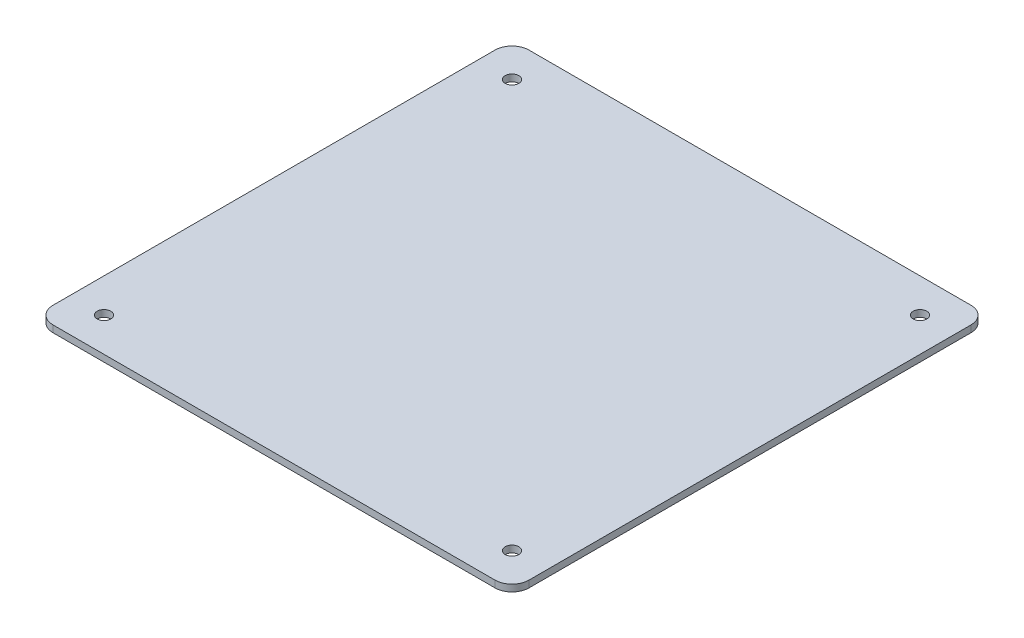
ISO-10303-21;
HEADER;
FILE_DESCRIPTION(('STEP AP214'),'2;1');
FILE_NAME('part.step','',(''),(''),'','','');
FILE_SCHEMA(('AUTOMOTIVE_DESIGN { 1 0 10303 214 1 1 1 1 }'));
ENDSEC;
DATA;
#1=APPLICATION_CONTEXT('core data for automotive mechanical design processes');
#2=APPLICATION_PROTOCOL_DEFINITION('international standard','automotive_design',2000,#1);
#3=PRODUCT_CONTEXT('',#1,'mechanical');
#4=PRODUCT('Part','Part','',(#3));
#5=PRODUCT_RELATED_PRODUCT_CATEGORY('part','',(#4));
#6=PRODUCT_DEFINITION_FORMATION('','',#4);
#7=PRODUCT_DEFINITION_CONTEXT('part definition',#1,'design');
#8=PRODUCT_DEFINITION('design','',#6,#7);
#9=PRODUCT_DEFINITION_SHAPE('','',#8);
#10=(LENGTH_UNIT() NAMED_UNIT(*) SI_UNIT(.MILLI.,.METRE.));
#11=(NAMED_UNIT(*) PLANE_ANGLE_UNIT() SI_UNIT($,.RADIAN.));
#12=(NAMED_UNIT(*) SI_UNIT($,.STERADIAN.) SOLID_ANGLE_UNIT());
#13=UNCERTAINTY_MEASURE_WITH_UNIT(LENGTH_MEASURE(1.E-05),#10,'distance_accuracy_value','');
#14=(GEOMETRIC_REPRESENTATION_CONTEXT(3) GLOBAL_UNCERTAINTY_ASSIGNED_CONTEXT((#13)) GLOBAL_UNIT_ASSIGNED_CONTEXT((#10,
#11,#12)) REPRESENTATION_CONTEXT('',''));
#15=CARTESIAN_POINT('',(0.,0.,0.));
#16=DIRECTION('',(0.,0.,1.));
#17=DIRECTION('',(1.,0.,0.));
#18=AXIS2_PLACEMENT_3D('',#15,#16,#17);
#19=CARTESIAN_POINT('',(-130.,4.,-130.));
#20=DIRECTION('',(0.,-1.,0.));
#21=DIRECTION('',(0.,0.,-1.));
#22=AXIS2_PLACEMENT_3D('',#19,#20,#21);
#23=CYLINDRICAL_SURFACE('',#22,10.);
#24=CARTESIAN_POINT('',(-130.,0.,-130.));
#25=DIRECTION('',(0.,1.,0.));
#26=DIRECTION('',(0.,0.,-1.));
#27=AXIS2_PLACEMENT_3D('',#24,#25,#26);
#28=CIRCLE('',#27,10.);
#29=CARTESIAN_POINT('',(-130.,0.,-140.));
#30=VERTEX_POINT('',#29);
#31=CARTESIAN_POINT('',(-140.,0.,-130.));
#32=VERTEX_POINT('',#31);
#33=EDGE_CURVE('E139',#30,#32,#28,.T.);
#34=ORIENTED_EDGE('',*,*,#33,.T.);
#35=DIRECTION('',(0.,-1.,0.));
#36=VECTOR('',#35,1.);
#37=CARTESIAN_POINT('',(-140.,4.,-130.));
#38=LINE('',#37,#36);
#39=CARTESIAN_POINT('',(-140.,4.,-130.));
#40=VERTEX_POINT('',#39);
#41=EDGE_CURVE('E11',#40,#32,#38,.T.);
#42=ORIENTED_EDGE('',*,*,#41,.F.);
#43=CARTESIAN_POINT('',(-130.,4.,-130.));
#44=DIRECTION('',(0.,1.,0.));
#45=DIRECTION('',(0.,0.,-1.));
#46=AXIS2_PLACEMENT_3D('',#43,#44,#45);
#47=CIRCLE('',#46,10.);
#48=CARTESIAN_POINT('',(-130.,4.,-140.));
#49=VERTEX_POINT('',#48);
#50=EDGE_CURVE('E162',#49,#40,#47,.T.);
#51=ORIENTED_EDGE('',*,*,#50,.F.);
#52=DIRECTION('',(0.,-1.,0.));
#53=VECTOR('',#52,1.);
#54=CARTESIAN_POINT('',(-130.,4.,-140.));
#55=LINE('',#54,#53);
#56=EDGE_CURVE('E135',#49,#30,#55,.T.);
#57=ORIENTED_EDGE('',*,*,#56,.T.);
#58=EDGE_LOOP('',(#34,#42,#51,#57));
#59=FACE_BOUND('',#58,.T.);
#60=ADVANCED_FACE('F38',(#59),#23,.T.);
#61=CARTESIAN_POINT('',(-140.,4.,130.));
#62=DIRECTION('',(1.,0.,0.));
#63=DIRECTION('',(0.,0.,-1.));
#64=AXIS2_PLACEMENT_3D('',#61,#62,#63);
#65=PLANE('',#64);
#66=DIRECTION('',(0.,0.,1.));
#67=VECTOR('',#66,1.);
#68=CARTESIAN_POINT('',(-140.,0.,130.));
#69=LINE('',#68,#67);
#70=CARTESIAN_POINT('',(-140.,0.,130.));
#71=VERTEX_POINT('',#70);
#72=EDGE_CURVE('E143',#32,#71,#69,.T.);
#73=ORIENTED_EDGE('',*,*,#72,.T.);
#74=DIRECTION('',(0.,-1.,0.));
#75=VECTOR('',#74,1.);
#76=CARTESIAN_POINT('',(-140.,4.,130.));
#77=LINE('',#76,#75);
#78=CARTESIAN_POINT('',(-140.,4.,130.));
#79=VERTEX_POINT('',#78);
#80=EDGE_CURVE('E47',#79,#71,#77,.T.);
#81=ORIENTED_EDGE('',*,*,#80,.F.);
#82=DIRECTION('',(0.,0.,1.));
#83=VECTOR('',#82,1.);
#84=CARTESIAN_POINT('',(-140.,4.,130.));
#85=LINE('',#84,#83);
#86=EDGE_CURVE('E98',#40,#79,#85,.T.);
#87=ORIENTED_EDGE('',*,*,#86,.F.);
#88=ORIENTED_EDGE('',*,*,#41,.T.);
#89=EDGE_LOOP('',(#73,#81,#87,#88));
#90=FACE_BOUND('',#89,.T.);
#91=ADVANCED_FACE('F267',(#90),#65,.F.);
#92=CARTESIAN_POINT('',(-130.,4.,130.));
#93=DIRECTION('',(0.,-1.,0.));
#94=DIRECTION('',(0.,0.,-1.));
#95=AXIS2_PLACEMENT_3D('',#92,#93,#94);
#96=CYLINDRICAL_SURFACE('',#95,10.);
#97=CARTESIAN_POINT('',(-130.,0.,130.));
#98=DIRECTION('',(0.,1.,0.));
#99=DIRECTION('',(0.,0.,-1.));
#100=AXIS2_PLACEMENT_3D('',#97,#98,#99);
#101=CIRCLE('',#100,10.);
#102=CARTESIAN_POINT('',(-130.,0.,140.));
#103=VERTEX_POINT('',#102);
#104=EDGE_CURVE('E147',#71,#103,#101,.T.);
#105=ORIENTED_EDGE('',*,*,#104,.T.);
#106=DIRECTION('',(0.,-1.,0.));
#107=VECTOR('',#106,1.);
#108=CARTESIAN_POINT('',(-130.,4.,140.));
#109=LINE('',#108,#107);
#110=CARTESIAN_POINT('',(-130.,4.,140.));
#111=VERTEX_POINT('',#110);
#112=EDGE_CURVE('E173',#111,#103,#109,.T.);
#113=ORIENTED_EDGE('',*,*,#112,.F.);
#114=CARTESIAN_POINT('',(-130.,4.,130.));
#115=DIRECTION('',(0.,1.,0.));
#116=DIRECTION('',(0.,0.,-1.));
#117=AXIS2_PLACEMENT_3D('',#114,#115,#116);
#118=CIRCLE('',#117,10.);
#119=EDGE_CURVE('E183',#79,#111,#118,.T.);
#120=ORIENTED_EDGE('',*,*,#119,.F.);
#121=ORIENTED_EDGE('',*,*,#80,.T.);
#122=EDGE_LOOP('',(#105,#113,#120,#121));
#123=FACE_BOUND('',#122,.T.);
#124=ADVANCED_FACE('F181',(#123),#96,.T.);
#125=CARTESIAN_POINT('',(-130.,4.,140.));
#126=DIRECTION('',(0.,0.,-1.));
#127=DIRECTION('',(-1.,0.,0.));
#128=AXIS2_PLACEMENT_3D('',#125,#126,#127);
#129=PLANE('',#128);
#130=DIRECTION('',(1.,0.,0.));
#131=VECTOR('',#130,1.);
#132=CARTESIAN_POINT('',(-130.,0.,140.));
#133=LINE('',#132,#131);
#134=CARTESIAN_POINT('',(130.,0.,140.));
#135=VERTEX_POINT('',#134);
#136=EDGE_CURVE('E150',#103,#135,#133,.T.);
#137=ORIENTED_EDGE('',*,*,#136,.T.);
#138=DIRECTION('',(0.,-1.,0.));
#139=VECTOR('',#138,1.);
#140=CARTESIAN_POINT('',(130.,4.,140.));
#141=LINE('',#140,#139);
#142=CARTESIAN_POINT('',(130.,4.,140.));
#143=VERTEX_POINT('',#142);
#144=EDGE_CURVE('E169',#143,#135,#141,.T.);
#145=ORIENTED_EDGE('',*,*,#144,.F.);
#146=DIRECTION('',(1.,0.,0.));
#147=VECTOR('',#146,1.);
#148=CARTESIAN_POINT('',(-130.,4.,140.));
#149=LINE('',#148,#147);
#150=EDGE_CURVE('E196',#111,#143,#149,.T.);
#151=ORIENTED_EDGE('',*,*,#150,.F.);
#152=ORIENTED_EDGE('',*,*,#112,.T.);
#153=EDGE_LOOP('',(#137,#145,#151,#152));
#154=FACE_BOUND('',#153,.T.);
#155=ADVANCED_FACE('F191',(#154),#129,.F.);
#156=CARTESIAN_POINT('',(130.,4.,130.));
#157=DIRECTION('',(0.,-1.,0.));
#158=DIRECTION('',(0.,0.,-1.));
#159=AXIS2_PLACEMENT_3D('',#156,#157,#158);
#160=CYLINDRICAL_SURFACE('',#159,10.);
#161=CARTESIAN_POINT('',(130.,0.,130.));
#162=DIRECTION('',(0.,1.,0.));
#163=DIRECTION('',(0.,0.,1.));
#164=AXIS2_PLACEMENT_3D('',#161,#162,#163);
#165=CIRCLE('',#164,10.);
#166=CARTESIAN_POINT('',(140.,0.,130.));
#167=VERTEX_POINT('',#166);
#168=EDGE_CURVE('E153',#135,#167,#165,.T.);
#169=ORIENTED_EDGE('',*,*,#168,.T.);
#170=DIRECTION('',(0.,-1.,0.));
#171=VECTOR('',#170,1.);
#172=CARTESIAN_POINT('',(140.,4.,130.));
#173=LINE('',#172,#171);
#174=CARTESIAN_POINT('',(140.,4.,130.));
#175=VERTEX_POINT('',#174);
#176=EDGE_CURVE('E128',#175,#167,#173,.T.);
#177=ORIENTED_EDGE('',*,*,#176,.F.);
#178=CARTESIAN_POINT('',(130.,4.,130.));
#179=DIRECTION('',(0.,1.,0.));
#180=DIRECTION('',(0.,0.,1.));
#181=AXIS2_PLACEMENT_3D('',#178,#179,#180);
#182=CIRCLE('',#181,10.);
#183=EDGE_CURVE('E117',#143,#175,#182,.T.);
#184=ORIENTED_EDGE('',*,*,#183,.F.);
#185=ORIENTED_EDGE('',*,*,#144,.T.);
#186=EDGE_LOOP('',(#169,#177,#184,#185));
#187=FACE_BOUND('',#186,.T.);
#188=ADVANCED_FACE('F194',(#187),#160,.T.);
#189=CARTESIAN_POINT('',(140.,4.,130.));
#190=DIRECTION('',(-1.,0.,0.));
#191=DIRECTION('',(0.,0.,1.));
#192=AXIS2_PLACEMENT_3D('',#189,#190,#191);
#193=PLANE('',#192);
#194=DIRECTION('',(0.,0.,-1.));
#195=VECTOR('',#194,1.);
#196=CARTESIAN_POINT('',(140.,0.,130.));
#197=LINE('',#196,#195);
#198=CARTESIAN_POINT('',(140.,0.,-130.));
#199=VERTEX_POINT('',#198);
#200=EDGE_CURVE('E126',#167,#199,#197,.T.);
#201=ORIENTED_EDGE('',*,*,#200,.T.);
#202=DIRECTION('',(0.,-1.,0.));
#203=VECTOR('',#202,1.);
#204=CARTESIAN_POINT('',(140.,4.,-130.));
#205=LINE('',#204,#203);
#206=CARTESIAN_POINT('',(140.,4.,-130.));
#207=VERTEX_POINT('',#206);
#208=EDGE_CURVE('E123',#207,#199,#205,.T.);
#209=ORIENTED_EDGE('',*,*,#208,.F.);
#210=DIRECTION('',(0.,0.,-1.));
#211=VECTOR('',#210,1.);
#212=CARTESIAN_POINT('',(140.,4.,130.));
#213=LINE('',#212,#211);
#214=EDGE_CURVE('E111',#175,#207,#213,.T.);
#215=ORIENTED_EDGE('',*,*,#214,.F.);
#216=ORIENTED_EDGE('',*,*,#176,.T.);
#217=EDGE_LOOP('',(#201,#209,#215,#216));
#218=FACE_BOUND('',#217,.T.);
#219=ADVANCED_FACE('F124',(#218),#193,.F.);
#220=CARTESIAN_POINT('',(130.,4.,-130.));
#221=DIRECTION('',(0.,-1.,0.));
#222=DIRECTION('',(0.,0.,-1.));
#223=AXIS2_PLACEMENT_3D('',#220,#221,#222);
#224=CYLINDRICAL_SURFACE('',#223,10.);
#225=CARTESIAN_POINT('',(130.,0.,-130.));
#226=DIRECTION('',(0.,1.,0.));
#227=DIRECTION('',(0.,0.,-1.));
#228=AXIS2_PLACEMENT_3D('',#225,#226,#227);
#229=CIRCLE('',#228,10.);
#230=CARTESIAN_POINT('',(130.,0.,-140.));
#231=VERTEX_POINT('',#230);
#232=EDGE_CURVE('E84',#199,#231,#229,.T.);
#233=ORIENTED_EDGE('',*,*,#232,.T.);
#234=DIRECTION('',(0.,-1.,0.));
#235=VECTOR('',#234,1.);
#236=CARTESIAN_POINT('',(130.,4.,-140.));
#237=LINE('',#236,#235);
#238=CARTESIAN_POINT('',(130.,4.,-140.));
#239=VERTEX_POINT('',#238);
#240=EDGE_CURVE('E129',#239,#231,#237,.T.);
#241=ORIENTED_EDGE('',*,*,#240,.F.);
#242=CARTESIAN_POINT('',(130.,4.,-130.));
#243=DIRECTION('',(0.,1.,0.));
#244=DIRECTION('',(0.,0.,-1.));
#245=AXIS2_PLACEMENT_3D('',#242,#243,#244);
#246=CIRCLE('',#245,10.);
#247=EDGE_CURVE('E115',#207,#239,#246,.T.);
#248=ORIENTED_EDGE('',*,*,#247,.F.);
#249=ORIENTED_EDGE('',*,*,#208,.T.);
#250=EDGE_LOOP('',(#233,#241,#248,#249));
#251=FACE_BOUND('',#250,.T.);
#252=ADVANCED_FACE('F131',(#251),#224,.T.);
#253=CARTESIAN_POINT('',(-130.,4.,-140.));
#254=DIRECTION('',(0.,0.,1.));
#255=DIRECTION('',(1.,0.,0.));
#256=AXIS2_PLACEMENT_3D('',#253,#254,#255);
#257=PLANE('',#256);
#258=DIRECTION('',(-1.,0.,0.));
#259=VECTOR('',#258,1.);
#260=CARTESIAN_POINT('',(-130.,0.,-140.));
#261=LINE('',#260,#259);
#262=EDGE_CURVE('E90',#231,#30,#261,.T.);
#263=ORIENTED_EDGE('',*,*,#262,.T.);
#264=ORIENTED_EDGE('',*,*,#56,.F.);
#265=DIRECTION('',(-1.,0.,0.));
#266=VECTOR('',#265,1.);
#267=CARTESIAN_POINT('',(-130.,4.,-140.));
#268=LINE('',#267,#266);
#269=EDGE_CURVE('E55',#239,#49,#268,.T.);
#270=ORIENTED_EDGE('',*,*,#269,.F.);
#271=ORIENTED_EDGE('',*,*,#240,.T.);
#272=EDGE_LOOP('',(#263,#264,#270,#271));
#273=FACE_BOUND('',#272,.T.);
#274=ADVANCED_FACE('F250',(#273),#257,.F.);
#275=CARTESIAN_POINT('',(-130.,4.,-130.));
#276=DIRECTION('',(0.,-1.,0.));
#277=DIRECTION('',(0.,0.,-1.));
#278=AXIS2_PLACEMENT_3D('',#275,#276,#277);
#279=PLANE('',#278);
#280=CARTESIAN_POINT('',(-120.,4.,-120.));
#281=DIRECTION('',(0.,1.,0.));
#282=DIRECTION('',(0.,0.,1.));
#283=AXIS2_PLACEMENT_3D('',#280,#281,#282);
#284=CIRCLE('',#283,3.99999999999999);
#285=CARTESIAN_POINT('',(-120.,4.,-116.));
#286=VERTEX_POINT('',#285);
#287=EDGE_CURVE('E214',#286,#286,#284,.T.);
#288=ORIENTED_EDGE('',*,*,#287,.F.);
#289=EDGE_LOOP('',(#288));
#290=FACE_BOUND('',#289,.T.);
#291=CARTESIAN_POINT('',(-120.,4.,120.));
#292=DIRECTION('',(0.,1.,0.));
#293=DIRECTION('',(0.,0.,1.));
#294=AXIS2_PLACEMENT_3D('',#291,#292,#293);
#295=CIRCLE('',#294,3.99999999999999);
#296=CARTESIAN_POINT('',(-120.,4.,124.));
#297=VERTEX_POINT('',#296);
#298=EDGE_CURVE('E222',#297,#297,#295,.T.);
#299=ORIENTED_EDGE('',*,*,#298,.F.);
#300=EDGE_LOOP('',(#299));
#301=FACE_BOUND('',#300,.T.);
#302=CARTESIAN_POINT('',(120.,4.,120.));
#303=DIRECTION('',(0.,1.,0.));
#304=DIRECTION('',(0.,0.,1.));
#305=AXIS2_PLACEMENT_3D('',#302,#303,#304);
#306=CIRCLE('',#305,4.00000000000001);
#307=CARTESIAN_POINT('',(120.,4.,124.));
#308=VERTEX_POINT('',#307);
#309=EDGE_CURVE('E230',#308,#308,#306,.T.);
#310=ORIENTED_EDGE('',*,*,#309,.F.);
#311=EDGE_LOOP('',(#310));
#312=FACE_BOUND('',#311,.T.);
#313=CARTESIAN_POINT('',(120.,4.,-120.));
#314=DIRECTION('',(0.,1.,0.));
#315=DIRECTION('',(0.,0.,1.));
#316=AXIS2_PLACEMENT_3D('',#313,#314,#315);
#317=CIRCLE('',#316,4.00000000000001);
#318=CARTESIAN_POINT('',(120.,4.,-116.));
#319=VERTEX_POINT('',#318);
#320=EDGE_CURVE('E206',#319,#319,#317,.T.);
#321=ORIENTED_EDGE('',*,*,#320,.F.);
#322=EDGE_LOOP('',(#321));
#323=FACE_BOUND('',#322,.T.);
#324=ORIENTED_EDGE('',*,*,#50,.T.);
#325=ORIENTED_EDGE('',*,*,#86,.T.);
#326=ORIENTED_EDGE('',*,*,#119,.T.);
#327=ORIENTED_EDGE('',*,*,#150,.T.);
#328=ORIENTED_EDGE('',*,*,#183,.T.);
#329=ORIENTED_EDGE('',*,*,#214,.T.);
#330=ORIENTED_EDGE('',*,*,#247,.T.);
#331=ORIENTED_EDGE('',*,*,#269,.T.);
#332=EDGE_LOOP('',(#324,#325,#326,#327,#328,#329,#330,#331));
#333=FACE_BOUND('',#332,.T.);
#334=ADVANCED_FACE('F113',(#290,#301,#312,#323,#333),#279,.F.);
#335=CARTESIAN_POINT('',(-130.,0.,-130.));
#336=DIRECTION('',(0.,-1.,0.));
#337=DIRECTION('',(0.,0.,-1.));
#338=AXIS2_PLACEMENT_3D('',#335,#336,#337);
#339=PLANE('',#338);
#340=CARTESIAN_POINT('',(-120.,0.,-120.));
#341=DIRECTION('',(0.,1.,0.));
#342=DIRECTION('',(0.,0.,1.));
#343=AXIS2_PLACEMENT_3D('',#340,#341,#342);
#344=CIRCLE('',#343,3.99999999999999);
#345=CARTESIAN_POINT('',(-120.,0.,-116.));
#346=VERTEX_POINT('',#345);
#347=EDGE_CURVE('E218',#346,#346,#344,.T.);
#348=ORIENTED_EDGE('',*,*,#347,.T.);
#349=EDGE_LOOP('',(#348));
#350=FACE_BOUND('',#349,.T.);
#351=CARTESIAN_POINT('',(-120.,0.,120.));
#352=DIRECTION('',(0.,1.,0.));
#353=DIRECTION('',(0.,0.,1.));
#354=AXIS2_PLACEMENT_3D('',#351,#352,#353);
#355=CIRCLE('',#354,3.99999999999999);
#356=CARTESIAN_POINT('',(-120.,0.,124.));
#357=VERTEX_POINT('',#356);
#358=EDGE_CURVE('E226',#357,#357,#355,.T.);
#359=ORIENTED_EDGE('',*,*,#358,.T.);
#360=EDGE_LOOP('',(#359));
#361=FACE_BOUND('',#360,.T.);
#362=CARTESIAN_POINT('',(120.,0.,120.));
#363=DIRECTION('',(0.,1.,0.));
#364=DIRECTION('',(0.,0.,1.));
#365=AXIS2_PLACEMENT_3D('',#362,#363,#364);
#366=CIRCLE('',#365,4.00000000000001);
#367=CARTESIAN_POINT('',(120.,0.,124.));
#368=VERTEX_POINT('',#367);
#369=EDGE_CURVE('E210',#368,#368,#366,.T.);
#370=ORIENTED_EDGE('',*,*,#369,.T.);
#371=EDGE_LOOP('',(#370));
#372=FACE_BOUND('',#371,.T.);
#373=CARTESIAN_POINT('',(120.,0.,-120.));
#374=DIRECTION('',(0.,1.,0.));
#375=DIRECTION('',(0.,0.,1.));
#376=AXIS2_PLACEMENT_3D('',#373,#374,#375);
#377=CIRCLE('',#376,4.00000000000001);
#378=CARTESIAN_POINT('',(120.,0.,-116.));
#379=VERTEX_POINT('',#378);
#380=EDGE_CURVE('E144',#379,#379,#377,.T.);
#381=ORIENTED_EDGE('',*,*,#380,.T.);
#382=EDGE_LOOP('',(#381));
#383=FACE_BOUND('',#382,.T.);
#384=ORIENTED_EDGE('',*,*,#33,.F.);
#385=ORIENTED_EDGE('',*,*,#262,.F.);
#386=ORIENTED_EDGE('',*,*,#232,.F.);
#387=ORIENTED_EDGE('',*,*,#200,.F.);
#388=ORIENTED_EDGE('',*,*,#168,.F.);
#389=ORIENTED_EDGE('',*,*,#136,.F.);
#390=ORIENTED_EDGE('',*,*,#104,.F.);
#391=ORIENTED_EDGE('',*,*,#72,.F.);
#392=EDGE_LOOP('',(#384,#385,#386,#387,#388,#389,#390,#391));
#393=FACE_BOUND('',#392,.T.);
#394=ADVANCED_FACE('F187',(#350,#361,#372,#383,#393),#339,.T.);
#395=CARTESIAN_POINT('',(120.,0.,-120.));
#396=DIRECTION('',(0.,1.,0.));
#397=DIRECTION('',(0.,0.,1.));
#398=AXIS2_PLACEMENT_3D('',#395,#396,#397);
#399=CYLINDRICAL_SURFACE('',#398,4.00000000000001);
#400=ORIENTED_EDGE('',*,*,#380,.F.);
#401=EDGE_LOOP('',(#400));
#402=FACE_BOUND('',#401,.T.);
#403=ORIENTED_EDGE('',*,*,#320,.T.);
#404=EDGE_LOOP('',(#403));
#405=FACE_BOUND('',#404,.T.);
#406=ADVANCED_FACE('F244',(#402,#405),#399,.F.);
#407=CARTESIAN_POINT('',(120.,0.,120.));
#408=DIRECTION('',(0.,1.,0.));
#409=DIRECTION('',(0.,0.,1.));
#410=AXIS2_PLACEMENT_3D('',#407,#408,#409);
#411=CYLINDRICAL_SURFACE('',#410,4.00000000000001);
#412=ORIENTED_EDGE('',*,*,#369,.F.);
#413=EDGE_LOOP('',(#412));
#414=FACE_BOUND('',#413,.T.);
#415=ORIENTED_EDGE('',*,*,#309,.T.);
#416=EDGE_LOOP('',(#415));
#417=FACE_BOUND('',#416,.T.);
#418=ADVANCED_FACE('F240',(#414,#417),#411,.F.);
#419=CARTESIAN_POINT('',(-120.,0.,120.));
#420=DIRECTION('',(0.,1.,0.));
#421=DIRECTION('',(0.,0.,1.));
#422=AXIS2_PLACEMENT_3D('',#419,#420,#421);
#423=CYLINDRICAL_SURFACE('',#422,3.99999999999999);
#424=ORIENTED_EDGE('',*,*,#358,.F.);
#425=EDGE_LOOP('',(#424));
#426=FACE_BOUND('',#425,.T.);
#427=ORIENTED_EDGE('',*,*,#298,.T.);
#428=EDGE_LOOP('',(#427));
#429=FACE_BOUND('',#428,.T.);
#430=ADVANCED_FACE('F243',(#426,#429),#423,.F.);
#431=CARTESIAN_POINT('',(-120.,0.,-120.));
#432=DIRECTION('',(0.,1.,0.));
#433=DIRECTION('',(0.,0.,1.));
#434=AXIS2_PLACEMENT_3D('',#431,#432,#433);
#435=CYLINDRICAL_SURFACE('',#434,3.99999999999999);
#436=ORIENTED_EDGE('',*,*,#347,.F.);
#437=EDGE_LOOP('',(#436));
#438=FACE_BOUND('',#437,.T.);
#439=ORIENTED_EDGE('',*,*,#287,.T.);
#440=EDGE_LOOP('',(#439));
#441=FACE_BOUND('',#440,.T.);
#442=ADVANCED_FACE('F338',(#438,#441),#435,.F.);
#443=CLOSED_SHELL('',(#60,#91,#124,#155,#188,#219,#252,#274,#334,#394,#406,#418,#430,#442));
#444=MANIFOLD_SOLID_BREP('B2',#443);
#445=ADVANCED_BREP_SHAPE_REPRESENTATION('',(#18,#444),#14);
#446=SHAPE_DEFINITION_REPRESENTATION(#9,#445);
ENDSEC;
END-ISO-10303-21;
